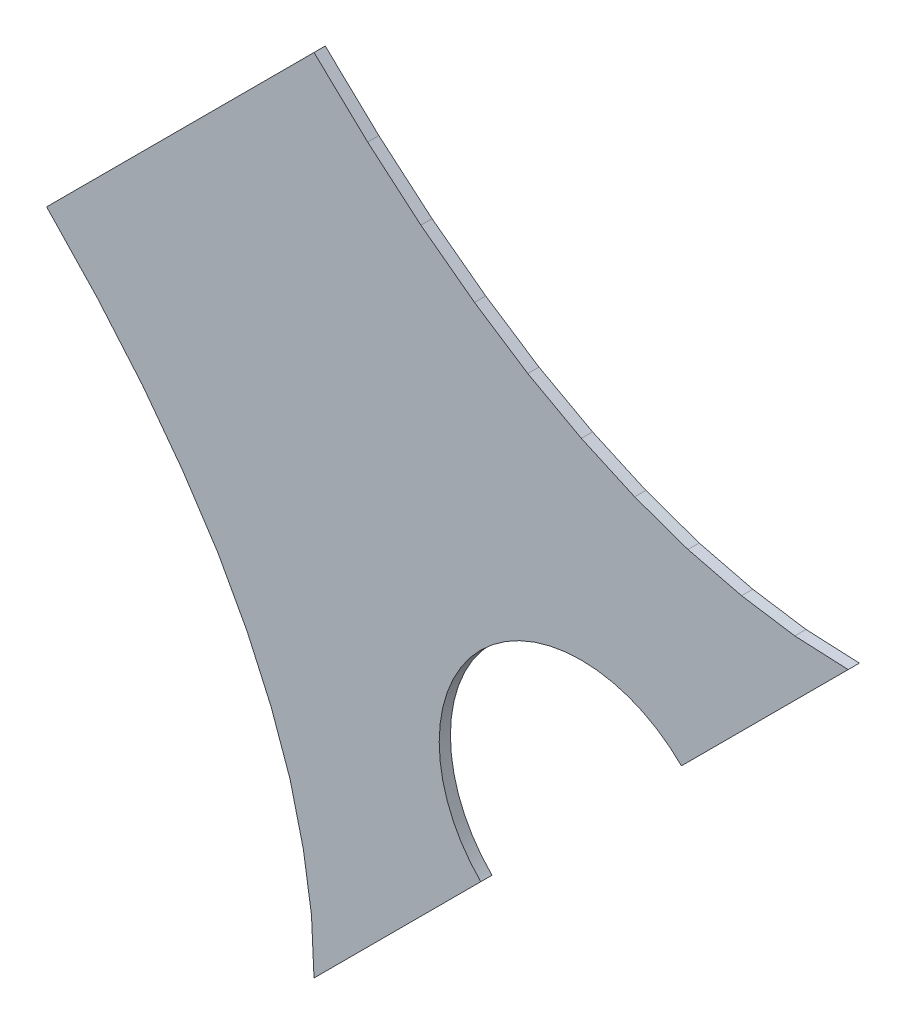
ISO-10303-21;
HEADER;
FILE_DESCRIPTION(('STEP AP214'),'2;1');
FILE_NAME('part.step','',(''),(''),'','','');
FILE_SCHEMA(('AUTOMOTIVE_DESIGN { 1 0 10303 214 1 1 1 1 }'));
ENDSEC;
DATA;
#1=APPLICATION_CONTEXT('core data for automotive mechanical design processes');
#2=APPLICATION_PROTOCOL_DEFINITION('international standard','automotive_design',2000,#1);
#3=PRODUCT_CONTEXT('',#1,'mechanical');
#4=PRODUCT('Part','Part','',(#3));
#5=PRODUCT_RELATED_PRODUCT_CATEGORY('part','',(#4));
#6=PRODUCT_DEFINITION_FORMATION('','',#4);
#7=PRODUCT_DEFINITION_CONTEXT('part definition',#1,'design');
#8=PRODUCT_DEFINITION('design','',#6,#7);
#9=PRODUCT_DEFINITION_SHAPE('','',#8);
#10=(LENGTH_UNIT() NAMED_UNIT(*) SI_UNIT(.MILLI.,.METRE.));
#11=(NAMED_UNIT(*) PLANE_ANGLE_UNIT() SI_UNIT($,.RADIAN.));
#12=(NAMED_UNIT(*) SI_UNIT($,.STERADIAN.) SOLID_ANGLE_UNIT());
#13=UNCERTAINTY_MEASURE_WITH_UNIT(LENGTH_MEASURE(1.E-05),#10,'distance_accuracy_value','');
#14=(GEOMETRIC_REPRESENTATION_CONTEXT(3) GLOBAL_UNCERTAINTY_ASSIGNED_CONTEXT((#13)) GLOBAL_UNIT_ASSIGNED_CONTEXT((#10,
#11,#12)) REPRESENTATION_CONTEXT('',''));
#15=CARTESIAN_POINT('',(0.,0.,0.));
#16=DIRECTION('',(0.,0.,1.));
#17=DIRECTION('',(1.,0.,0.));
#18=AXIS2_PLACEMENT_3D('',#15,#16,#17);
#19=CARTESIAN_POINT('',(35.0530014038086,57.6549987792969,0.));
#20=DIRECTION('',(0.707106781186548,-0.707106781186548,0.));
#21=DIRECTION('',(-0.707106781186548,-0.707106781186548,0.));
#22=AXIS2_PLACEMENT_3D('',#19,#20,#21);
#23=PLANE('',#22);
#24=DIRECTION('',(-0.707106781186548,-0.707106781186548,0.));
#25=VECTOR('',#24,1.);
#26=CARTESIAN_POINT('',(35.0530014038086,57.6549987792969,0.03556));
#27=LINE('',#26,#25);
#28=CARTESIAN_POINT('',(35.0530014038086,57.6549987792969,0.03556));
#29=VERTEX_POINT('',#28);
#30=CARTESIAN_POINT('',(34.2050018310547,56.806999206543,0.03556));
#31=VERTEX_POINT('',#30);
#32=EDGE_CURVE('E11',#29,#31,#27,.T.);
#33=ORIENTED_EDGE('',*,*,#32,.F.);
#34=DIRECTION('',(0.,0.,1.));
#35=VECTOR('',#34,1.);
#36=CARTESIAN_POINT('',(35.0530014038086,57.6549987792969,0.));
#37=LINE('',#36,#35);
#38=CARTESIAN_POINT('',(35.0530014038086,57.6549987792969,0.));
#39=VERTEX_POINT('',#38);
#40=EDGE_CURVE('E24',#39,#29,#37,.T.);
#41=ORIENTED_EDGE('',*,*,#40,.F.);
#42=DIRECTION('',(-0.707106781186548,-0.707106781186548,0.));
#43=VECTOR('',#42,1.);
#44=CARTESIAN_POINT('',(35.0530014038086,57.6549987792969,0.));
#45=LINE('',#44,#43);
#46=CARTESIAN_POINT('',(34.2050018310547,56.806999206543,0.));
#47=VERTEX_POINT('',#46);
#48=EDGE_CURVE('E367',#39,#47,#45,.T.);
#49=ORIENTED_EDGE('',*,*,#48,.T.);
#50=DIRECTION('',(0.,0.,1.));
#51=VECTOR('',#50,1.);
#52=CARTESIAN_POINT('',(34.2050018310547,56.806999206543,0.));
#53=LINE('',#52,#51);
#54=EDGE_CURVE('E37',#47,#31,#53,.T.);
#55=ORIENTED_EDGE('',*,*,#54,.T.);
#56=EDGE_LOOP('',(#33,#41,#49,#55));
#57=FACE_BOUND('',#56,.T.);
#58=ADVANCED_FACE('F17',(#57),#23,.F.);
#59=CARTESIAN_POINT('',(35.2229995727539,57.4939994812012,0.));
#60=DIRECTION('',(-0.687628497961124,-0.726062703071662,0.));
#61=DIRECTION('',(-0.726062703071662,0.687628497961124,0.));
#62=AXIS2_PLACEMENT_3D('',#59,#60,#61);
#63=PLANE('',#62);
#64=DIRECTION('',(-0.726062703071662,0.687628497961124,0.));
#65=VECTOR('',#64,1.);
#66=CARTESIAN_POINT('',(35.2229995727539,57.4939994812012,0.03556));
#67=LINE('',#66,#65);
#68=CARTESIAN_POINT('',(35.2229995727539,57.4939994812012,0.03556));
#69=VERTEX_POINT('',#68);
#70=EDGE_CURVE('E363',#69,#29,#67,.T.);
#71=ORIENTED_EDGE('',*,*,#70,.F.);
#72=DIRECTION('',(0.,0.,1.));
#73=VECTOR('',#72,1.);
#74=CARTESIAN_POINT('',(35.2229995727539,57.4939994812012,0.));
#75=LINE('',#74,#73);
#76=CARTESIAN_POINT('',(35.2229995727539,57.4939994812012,0.));
#77=VERTEX_POINT('',#76);
#78=EDGE_CURVE('E361',#77,#69,#75,.T.);
#79=ORIENTED_EDGE('',*,*,#78,.F.);
#80=DIRECTION('',(-0.726062703071662,0.687628497961124,0.));
#81=VECTOR('',#80,1.);
#82=CARTESIAN_POINT('',(35.2229995727539,57.4939994812012,0.));
#83=LINE('',#82,#81);
#84=EDGE_CURVE('E359',#77,#39,#83,.T.);
#85=ORIENTED_EDGE('',*,*,#84,.T.);
#86=ORIENTED_EDGE('',*,*,#40,.T.);
#87=EDGE_LOOP('',(#71,#79,#85,#86));
#88=FACE_BOUND('',#87,.T.);
#89=ADVANCED_FACE('F370',(#88),#63,.F.);
#90=CARTESIAN_POINT('',(35.3919982910156,57.3499984741211,0.));
#91=DIRECTION('',(-0.648568593878448,-0.761156211979205,0.));
#92=DIRECTION('',(-0.761156211979205,0.648568593878448,0.));
#93=AXIS2_PLACEMENT_3D('',#90,#91,#92);
#94=PLANE('',#93);
#95=DIRECTION('',(-0.761156211979205,0.648568593878448,0.));
#96=VECTOR('',#95,1.);
#97=CARTESIAN_POINT('',(35.3919982910156,57.3499984741211,0.03556));
#98=LINE('',#97,#96);
#99=CARTESIAN_POINT('',(35.3919982910156,57.3499984741211,0.03556));
#100=VERTEX_POINT('',#99);
#101=EDGE_CURVE('E356',#100,#69,#98,.T.);
#102=ORIENTED_EDGE('',*,*,#101,.F.);
#103=DIRECTION('',(0.,0.,1.));
#104=VECTOR('',#103,1.);
#105=CARTESIAN_POINT('',(35.3919982910156,57.3499984741211,0.));
#106=LINE('',#105,#104);
#107=CARTESIAN_POINT('',(35.3919982910156,57.3499984741211,0.));
#108=VERTEX_POINT('',#107);
#109=EDGE_CURVE('E354',#108,#100,#106,.T.);
#110=ORIENTED_EDGE('',*,*,#109,.F.);
#111=DIRECTION('',(-0.761156211979205,0.648568593878448,0.));
#112=VECTOR('',#111,1.);
#113=CARTESIAN_POINT('',(35.3919982910156,57.3499984741211,0.));
#114=LINE('',#113,#112);
#115=EDGE_CURVE('E351',#108,#77,#114,.T.);
#116=ORIENTED_EDGE('',*,*,#115,.T.);
#117=ORIENTED_EDGE('',*,*,#78,.T.);
#118=EDGE_LOOP('',(#102,#110,#116,#117));
#119=FACE_BOUND('',#118,.T.);
#120=ADVANCED_FACE('F373',(#119),#94,.F.);
#121=CARTESIAN_POINT('',(35.5620002746582,57.2229995727539,0.));
#122=DIRECTION('',(-0.598483120475566,-0.801135415835444,0.));
#123=DIRECTION('',(-0.801135415835444,0.598483120475566,0.));
#124=AXIS2_PLACEMENT_3D('',#121,#122,#123);
#125=PLANE('',#124);
#126=DIRECTION('',(-0.801135415835444,0.598483120475566,0.));
#127=VECTOR('',#126,1.);
#128=CARTESIAN_POINT('',(35.5620002746582,57.2229995727539,0.03556));
#129=LINE('',#128,#127);
#130=CARTESIAN_POINT('',(35.5620002746582,57.2229995727539,0.03556));
#131=VERTEX_POINT('',#130);
#132=EDGE_CURVE('E348',#131,#100,#129,.T.);
#133=ORIENTED_EDGE('',*,*,#132,.F.);
#134=DIRECTION('',(0.,0.,1.));
#135=VECTOR('',#134,1.);
#136=CARTESIAN_POINT('',(35.5620002746582,57.2229995727539,0.));
#137=LINE('',#136,#135);
#138=CARTESIAN_POINT('',(35.5620002746582,57.2229995727539,0.));
#139=VERTEX_POINT('',#138);
#140=EDGE_CURVE('E346',#139,#131,#137,.T.);
#141=ORIENTED_EDGE('',*,*,#140,.F.);
#142=DIRECTION('',(-0.801135415835444,0.598483120475566,0.));
#143=VECTOR('',#142,1.);
#144=CARTESIAN_POINT('',(35.5620002746582,57.2229995727539,0.));
#145=LINE('',#144,#143);
#146=EDGE_CURVE('E343',#139,#108,#145,.T.);
#147=ORIENTED_EDGE('',*,*,#146,.T.);
#148=ORIENTED_EDGE('',*,*,#109,.T.);
#149=EDGE_LOOP('',(#133,#141,#147,#148));
#150=FACE_BOUND('',#149,.T.);
#151=ADVANCED_FACE('F378',(#150),#125,.F.);
#152=CARTESIAN_POINT('',(35.7309989929199,57.1119995117188,0.));
#153=DIRECTION('',(-0.548983611370838,-0.8358331139924,0.));
#154=DIRECTION('',(-0.8358331139924,0.548983611370838,0.));
#155=AXIS2_PLACEMENT_3D('',#152,#153,#154);
#156=PLANE('',#155);
#157=DIRECTION('',(-0.8358331139924,0.548983611370838,0.));
#158=VECTOR('',#157,1.);
#159=CARTESIAN_POINT('',(35.7309989929199,57.1119995117188,0.03556));
#160=LINE('',#159,#158);
#161=CARTESIAN_POINT('',(35.7309989929199,57.1119995117188,0.03556));
#162=VERTEX_POINT('',#161);
#163=EDGE_CURVE('E340',#162,#131,#160,.T.);
#164=ORIENTED_EDGE('',*,*,#163,.F.);
#165=DIRECTION('',(0.,0.,1.));
#166=VECTOR('',#165,1.);
#167=CARTESIAN_POINT('',(35.7309989929199,57.1119995117188,0.));
#168=LINE('',#167,#166);
#169=CARTESIAN_POINT('',(35.7309989929199,57.1119995117188,0.));
#170=VERTEX_POINT('',#169);
#171=EDGE_CURVE('E338',#170,#162,#168,.T.);
#172=ORIENTED_EDGE('',*,*,#171,.F.);
#173=DIRECTION('',(-0.8358331139924,0.548983611370838,0.));
#174=VECTOR('',#173,1.);
#175=CARTESIAN_POINT('',(35.7309989929199,57.1119995117188,0.));
#176=LINE('',#175,#174);
#177=EDGE_CURVE('E335',#170,#139,#176,.T.);
#178=ORIENTED_EDGE('',*,*,#177,.T.);
#179=ORIENTED_EDGE('',*,*,#140,.T.);
#180=EDGE_LOOP('',(#164,#172,#178,#179));
#181=FACE_BOUND('',#180,.T.);
#182=ADVANCED_FACE('F381',(#181),#156,.F.);
#183=CARTESIAN_POINT('',(35.9010009765625,57.0190010070801,0.));
#184=DIRECTION('',(-0.479926229158131,-0.877308847878589,0.));
#185=DIRECTION('',(-0.877308847878589,0.479926229158131,0.));
#186=AXIS2_PLACEMENT_3D('',#183,#184,#185);
#187=PLANE('',#186);
#188=DIRECTION('',(-0.877308847878589,0.479926229158131,0.));
#189=VECTOR('',#188,1.);
#190=CARTESIAN_POINT('',(35.9010009765625,57.0190010070801,0.03556));
#191=LINE('',#190,#189);
#192=CARTESIAN_POINT('',(35.9010009765625,57.0190010070801,0.03556));
#193=VERTEX_POINT('',#192);
#194=EDGE_CURVE('E332',#193,#162,#191,.T.);
#195=ORIENTED_EDGE('',*,*,#194,.F.);
#196=DIRECTION('',(0.,0.,1.));
#197=VECTOR('',#196,1.);
#198=CARTESIAN_POINT('',(35.9010009765625,57.0190010070801,0.));
#199=LINE('',#198,#197);
#200=CARTESIAN_POINT('',(35.9010009765625,57.0190010070801,0.));
#201=VERTEX_POINT('',#200);
#202=EDGE_CURVE('E330',#201,#193,#199,.T.);
#203=ORIENTED_EDGE('',*,*,#202,.F.);
#204=DIRECTION('',(-0.877308847878589,0.479926229158131,0.));
#205=VECTOR('',#204,1.);
#206=CARTESIAN_POINT('',(35.9010009765625,57.0190010070801,0.));
#207=LINE('',#206,#205);
#208=EDGE_CURVE('E327',#201,#170,#207,.T.);
#209=ORIENTED_EDGE('',*,*,#208,.T.);
#210=ORIENTED_EDGE('',*,*,#171,.T.);
#211=EDGE_LOOP('',(#195,#203,#209,#210));
#212=FACE_BOUND('',#211,.T.);
#213=ADVANCED_FACE('F386',(#212),#187,.F.);
#214=CARTESIAN_POINT('',(36.0699996948242,56.943000793457,0.));
#215=DIRECTION('',(-0.410143821061832,-0.912020858338668,0.));
#216=DIRECTION('',(-0.912020858338668,0.410143821061832,0.));
#217=AXIS2_PLACEMENT_3D('',#214,#215,#216);
#218=PLANE('',#217);
#219=DIRECTION('',(-0.912020858338668,0.410143821061832,0.));
#220=VECTOR('',#219,1.);
#221=CARTESIAN_POINT('',(36.0699996948242,56.943000793457,0.03556));
#222=LINE('',#221,#220);
#223=CARTESIAN_POINT('',(36.0699996948242,56.943000793457,0.03556));
#224=VERTEX_POINT('',#223);
#225=EDGE_CURVE('E324',#224,#193,#222,.T.);
#226=ORIENTED_EDGE('',*,*,#225,.F.);
#227=DIRECTION('',(0.,0.,1.));
#228=VECTOR('',#227,1.);
#229=CARTESIAN_POINT('',(36.0699996948242,56.943000793457,0.));
#230=LINE('',#229,#228);
#231=CARTESIAN_POINT('',(36.0699996948242,56.943000793457,0.));
#232=VERTEX_POINT('',#231);
#233=EDGE_CURVE('E322',#232,#224,#230,.T.);
#234=ORIENTED_EDGE('',*,*,#233,.F.);
#235=DIRECTION('',(-0.912020858338668,0.410143821061832,0.));
#236=VECTOR('',#235,1.);
#237=CARTESIAN_POINT('',(36.0699996948242,56.943000793457,0.));
#238=LINE('',#237,#236);
#239=EDGE_CURVE('E319',#232,#201,#238,.T.);
#240=ORIENTED_EDGE('',*,*,#239,.T.);
#241=ORIENTED_EDGE('',*,*,#202,.T.);
#242=EDGE_LOOP('',(#226,#234,#240,#241));
#243=FACE_BOUND('',#242,.T.);
#244=ADVANCED_FACE('F389',(#243),#218,.F.);
#245=CARTESIAN_POINT('',(36.2389984130859,56.882999420166,0.));
#246=DIRECTION('',(-0.334578654917434,-0.942367828225073,0.));
#247=DIRECTION('',(-0.942367828225073,0.334578654917434,0.));
#248=AXIS2_PLACEMENT_3D('',#245,#246,#247);
#249=PLANE('',#248);
#250=DIRECTION('',(-0.942367828225073,0.334578654917434,0.));
#251=VECTOR('',#250,1.);
#252=CARTESIAN_POINT('',(36.2389984130859,56.882999420166,0.03556));
#253=LINE('',#252,#251);
#254=CARTESIAN_POINT('',(36.2389984130859,56.882999420166,0.03556));
#255=VERTEX_POINT('',#254);
#256=EDGE_CURVE('E316',#255,#224,#253,.T.);
#257=ORIENTED_EDGE('',*,*,#256,.F.);
#258=DIRECTION('',(0.,0.,1.));
#259=VECTOR('',#258,1.);
#260=CARTESIAN_POINT('',(36.2389984130859,56.882999420166,0.));
#261=LINE('',#260,#259);
#262=CARTESIAN_POINT('',(36.2389984130859,56.882999420166,0.));
#263=VERTEX_POINT('',#262);
#264=EDGE_CURVE('E314',#263,#255,#261,.T.);
#265=ORIENTED_EDGE('',*,*,#264,.F.);
#266=DIRECTION('',(-0.942367828225073,0.334578654917434,0.));
#267=VECTOR('',#266,1.);
#268=CARTESIAN_POINT('',(36.2389984130859,56.882999420166,0.));
#269=LINE('',#268,#267);
#270=EDGE_CURVE('E311',#263,#232,#269,.T.);
#271=ORIENTED_EDGE('',*,*,#270,.T.);
#272=ORIENTED_EDGE('',*,*,#233,.T.);
#273=EDGE_LOOP('',(#257,#265,#271,#272));
#274=FACE_BOUND('',#273,.T.);
#275=ADVANCED_FACE('F394',(#274),#249,.F.);
#276=CARTESIAN_POINT('',(36.4090003967285,56.8409996032715,0.));
#277=DIRECTION('',(-0.239843706355108,-0.970811514415566,0.));
#278=DIRECTION('',(-0.970811514415566,0.239843706355108,0.));
#279=AXIS2_PLACEMENT_3D('',#276,#277,#278);
#280=PLANE('',#279);
#281=DIRECTION('',(-0.970811514415566,0.239843706355108,0.));
#282=VECTOR('',#281,1.);
#283=CARTESIAN_POINT('',(36.4090003967285,56.8409996032715,0.03556));
#284=LINE('',#283,#282);
#285=CARTESIAN_POINT('',(36.4090003967285,56.8409996032715,0.03556));
#286=VERTEX_POINT('',#285);
#287=EDGE_CURVE('E308',#286,#255,#284,.T.);
#288=ORIENTED_EDGE('',*,*,#287,.F.);
#289=DIRECTION('',(0.,0.,1.));
#290=VECTOR('',#289,1.);
#291=CARTESIAN_POINT('',(36.4090003967285,56.8409996032715,0.));
#292=LINE('',#291,#290);
#293=CARTESIAN_POINT('',(36.4090003967285,56.8409996032715,0.));
#294=VERTEX_POINT('',#293);
#295=EDGE_CURVE('E306',#294,#286,#292,.T.);
#296=ORIENTED_EDGE('',*,*,#295,.F.);
#297=DIRECTION('',(-0.970811514415566,0.239843706355108,0.));
#298=VECTOR('',#297,1.);
#299=CARTESIAN_POINT('',(36.4090003967285,56.8409996032715,0.));
#300=LINE('',#299,#298);
#301=EDGE_CURVE('E303',#294,#263,#300,.T.);
#302=ORIENTED_EDGE('',*,*,#301,.T.);
#303=ORIENTED_EDGE('',*,*,#264,.T.);
#304=EDGE_LOOP('',(#288,#296,#302,#303));
#305=FACE_BOUND('',#304,.T.);
#306=ADVANCED_FACE('F397',(#305),#280,.F.);
#307=CARTESIAN_POINT('',(36.5779991149902,56.814998626709,0.));
#308=DIRECTION('',(-0.152063890099214,-0.988370665958827,0.));
#309=DIRECTION('',(-0.988370665958827,0.152063890099214,0.));
#310=AXIS2_PLACEMENT_3D('',#307,#308,#309);
#311=PLANE('',#310);
#312=DIRECTION('',(-0.988370665958827,0.152063890099214,0.));
#313=VECTOR('',#312,1.);
#314=CARTESIAN_POINT('',(36.5779991149902,56.814998626709,0.03556));
#315=LINE('',#314,#313);
#316=CARTESIAN_POINT('',(36.5779991149902,56.814998626709,0.03556));
#317=VERTEX_POINT('',#316);
#318=EDGE_CURVE('E300',#317,#286,#315,.T.);
#319=ORIENTED_EDGE('',*,*,#318,.F.);
#320=DIRECTION('',(0.,0.,1.));
#321=VECTOR('',#320,1.);
#322=CARTESIAN_POINT('',(36.5779991149902,56.814998626709,0.));
#323=LINE('',#322,#321);
#324=CARTESIAN_POINT('',(36.5779991149902,56.814998626709,0.));
#325=VERTEX_POINT('',#324);
#326=EDGE_CURVE('E298',#325,#317,#323,.T.);
#327=ORIENTED_EDGE('',*,*,#326,.F.);
#328=DIRECTION('',(-0.988370665958827,0.152063890099214,0.));
#329=VECTOR('',#328,1.);
#330=CARTESIAN_POINT('',(36.5779991149902,56.814998626709,0.));
#331=LINE('',#330,#329);
#332=EDGE_CURVE('E295',#325,#294,#331,.T.);
#333=ORIENTED_EDGE('',*,*,#332,.T.);
#334=ORIENTED_EDGE('',*,*,#295,.T.);
#335=EDGE_LOOP('',(#319,#327,#333,#334));
#336=FACE_BOUND('',#335,.T.);
#337=ADVANCED_FACE('F402',(#336),#311,.F.);
#338=CARTESIAN_POINT('',(36.7470016479492,56.806999206543,0.));
#339=DIRECTION('',(-0.0472802034462182,-0.998881665845402,0.));
#340=DIRECTION('',(-0.998881665845402,0.0472802034462182,0.));
#341=AXIS2_PLACEMENT_3D('',#338,#339,#340);
#342=PLANE('',#341);
#343=DIRECTION('',(-0.998881665845401,0.0472802034462182,0.));
#344=VECTOR('',#343,1.);
#345=CARTESIAN_POINT('',(36.7470016479492,56.806999206543,0.03556));
#346=LINE('',#345,#344);
#347=CARTESIAN_POINT('',(36.7470016479492,56.806999206543,0.03556));
#348=VERTEX_POINT('',#347);
#349=EDGE_CURVE('E292',#348,#317,#346,.T.);
#350=ORIENTED_EDGE('',*,*,#349,.F.);
#351=DIRECTION('',(0.,0.,1.));
#352=VECTOR('',#351,1.);
#353=CARTESIAN_POINT('',(36.7470016479492,56.806999206543,0.));
#354=LINE('',#353,#352);
#355=CARTESIAN_POINT('',(36.7470016479492,56.806999206543,0.));
#356=VERTEX_POINT('',#355);
#357=EDGE_CURVE('E290',#356,#348,#354,.T.);
#358=ORIENTED_EDGE('',*,*,#357,.F.);
#359=DIRECTION('',(-0.998881665845401,0.0472802034462182,0.));
#360=VECTOR('',#359,1.);
#361=CARTESIAN_POINT('',(36.7470016479492,56.806999206543,0.));
#362=LINE('',#361,#360);
#363=EDGE_CURVE('E287',#356,#325,#362,.T.);
#364=ORIENTED_EDGE('',*,*,#363,.T.);
#365=ORIENTED_EDGE('',*,*,#326,.T.);
#366=EDGE_LOOP('',(#350,#358,#364,#365));
#367=FACE_BOUND('',#366,.T.);
#368=ADVANCED_FACE('F405',(#367),#342,.F.);
#369=CARTESIAN_POINT('',(36.2182058358156,56.2782033944093,0.));
#370=DIRECTION('',(-0.707106781186548,0.707106781186548,0.));
#371=DIRECTION('',(0.707106781186548,0.707106781186548,0.));
#372=AXIS2_PLACEMENT_3D('',#369,#370,#371);
#373=PLANE('',#372);
#374=DIRECTION('',(0.707106781186548,0.707106781186548,0.));
#375=VECTOR('',#374,1.);
#376=CARTESIAN_POINT('',(35.0530014038086,55.1129989624023,0.03556));
#377=LINE('',#376,#375);
#378=CARTESIAN_POINT('',(36.2182058358156,56.2782033944093,0.03556));
#379=VERTEX_POINT('',#378);
#380=EDGE_CURVE('E284',#379,#348,#377,.T.);
#381=ORIENTED_EDGE('',*,*,#380,.F.);
#382=DIRECTION('',(0.,0.,1.));
#383=VECTOR('',#382,1.);
#384=CARTESIAN_POINT('',(36.2182058358156,56.2782033944093,0.));
#385=LINE('',#384,#383);
#386=CARTESIAN_POINT('',(36.2182058358156,56.2782033944093,0.));
#387=VERTEX_POINT('',#386);
#388=EDGE_CURVE('E282',#387,#379,#385,.T.);
#389=ORIENTED_EDGE('',*,*,#388,.F.);
#390=DIRECTION('',(0.707106781186548,0.707106781186548,0.));
#391=VECTOR('',#390,1.);
#392=CARTESIAN_POINT('',(35.0530014038086,55.1129989624023,0.));
#393=LINE('',#392,#391);
#394=EDGE_CURVE('E279',#387,#356,#393,.T.);
#395=ORIENTED_EDGE('',*,*,#394,.T.);
#396=ORIENTED_EDGE('',*,*,#357,.T.);
#397=EDGE_LOOP('',(#381,#389,#395,#396));
#398=FACE_BOUND('',#397,.T.);
#399=ADVANCED_FACE('F410',(#398),#373,.F.);
#400=CARTESIAN_POINT('',(35.9000044,55.96001,0.));
#401=DIRECTION('',(0.,0.,-1.));
#402=DIRECTION('',(1.,0.,0.));
#403=AXIS2_PLACEMENT_3D('',#400,#401,#402);
#404=CYLINDRICAL_SURFACE('',#403,0.4499991);
#405=ORIENTED_EDGE('',*,*,#388,.T.);
#406=CARTESIAN_POINT('',(35.9000044,55.96001,0.03556));
#407=DIRECTION('',(0.,0.,1.));
#408=DIRECTION('',(1.,0.,0.));
#409=AXIS2_PLACEMENT_3D('',#406,#407,#408);
#410=CIRCLE('',#409,0.4499991);
#411=CARTESIAN_POINT('',(35.5818110055907,55.6418085641844,0.03556));
#412=VERTEX_POINT('',#411);
#413=EDGE_CURVE('E276',#379,#412,#410,.T.);
#414=ORIENTED_EDGE('',*,*,#413,.T.);
#415=DIRECTION('',(0.,0.,1.));
#416=VECTOR('',#415,1.);
#417=CARTESIAN_POINT('',(35.5818110055907,55.6418085641844,0.));
#418=LINE('',#417,#416);
#419=CARTESIAN_POINT('',(35.5818110055907,55.6418085641844,0.));
#420=VERTEX_POINT('',#419);
#421=EDGE_CURVE('E274',#420,#412,#418,.T.);
#422=ORIENTED_EDGE('',*,*,#421,.F.);
#423=CARTESIAN_POINT('',(35.9000044,55.96001,0.));
#424=DIRECTION('',(0.,0.,1.));
#425=DIRECTION('',(1.,0.,0.));
#426=AXIS2_PLACEMENT_3D('',#423,#424,#425);
#427=CIRCLE('',#426,0.4499991);
#428=EDGE_CURVE('E271',#387,#420,#427,.T.);
#429=ORIENTED_EDGE('',*,*,#428,.F.);
#430=EDGE_LOOP('',(#405,#414,#422,#429));
#431=FACE_BOUND('',#430,.T.);
#432=ADVANCED_FACE('F413',(#431),#404,.F.);
#433=CARTESIAN_POINT('',(35.0530014038086,55.1129989624023,0.));
#434=DIRECTION('',(-0.707106781186548,0.707106781186548,0.));
#435=DIRECTION('',(0.707106781186548,0.707106781186548,0.));
#436=AXIS2_PLACEMENT_3D('',#433,#434,#435);
#437=PLANE('',#436);
#438=DIRECTION('',(0.707106781186548,0.707106781186548,0.));
#439=VECTOR('',#438,1.);
#440=CARTESIAN_POINT('',(35.0530014038086,55.1129989624023,0.03556));
#441=LINE('',#440,#439);
#442=CARTESIAN_POINT('',(35.0530014038086,55.1129989624023,0.03556));
#443=VERTEX_POINT('',#442);
#444=EDGE_CURVE('E268',#443,#412,#441,.T.);
#445=ORIENTED_EDGE('',*,*,#444,.F.);
#446=DIRECTION('',(0.,0.,1.));
#447=VECTOR('',#446,1.);
#448=CARTESIAN_POINT('',(35.0530014038086,55.1129989624023,0.));
#449=LINE('',#448,#447);
#450=CARTESIAN_POINT('',(35.0530014038086,55.1129989624023,0.));
#451=VERTEX_POINT('',#450);
#452=EDGE_CURVE('E266',#451,#443,#449,.T.);
#453=ORIENTED_EDGE('',*,*,#452,.F.);
#454=EDGE_CURVE('E265',#451,#420,#393,.T.);
#455=ORIENTED_EDGE('',*,*,#454,.T.);
#456=ORIENTED_EDGE('',*,*,#421,.T.);
#457=EDGE_LOOP('',(#445,#453,#455,#456));
#458=FACE_BOUND('',#457,.T.);
#459=ADVANCED_FACE('F419',(#458),#437,.F.);
#460=CARTESIAN_POINT('',(35.0449981689453,55.2820014953613,0.));
#461=DIRECTION('',(0.99888060077791,0.0473026996012021,0.));
#462=DIRECTION('',(0.0473026996012021,-0.99888060077791,0.));
#463=AXIS2_PLACEMENT_3D('',#460,#461,#462);
#464=PLANE('',#463);
#465=DIRECTION('',(0.0473026996012021,-0.99888060077791,0.));
#466=VECTOR('',#465,1.);
#467=CARTESIAN_POINT('',(35.0449981689453,55.2820014953613,0.03556));
#468=LINE('',#467,#466);
#469=CARTESIAN_POINT('',(35.0449981689453,55.2820014953613,0.03556));
#470=VERTEX_POINT('',#469);
#471=EDGE_CURVE('E262',#470,#443,#468,.T.);
#472=ORIENTED_EDGE('',*,*,#471,.F.);
#473=DIRECTION('',(0.,0.,1.));
#474=VECTOR('',#473,1.);
#475=CARTESIAN_POINT('',(35.0449981689453,55.2820014953613,0.));
#476=LINE('',#475,#474);
#477=CARTESIAN_POINT('',(35.0449981689453,55.2820014953613,0.));
#478=VERTEX_POINT('',#477);
#479=EDGE_CURVE('E260',#478,#470,#476,.T.);
#480=ORIENTED_EDGE('',*,*,#479,.F.);
#481=DIRECTION('',(0.0473026996012021,-0.99888060077791,0.));
#482=VECTOR('',#481,1.);
#483=CARTESIAN_POINT('',(35.0449981689453,55.2820014953613,0.));
#484=LINE('',#483,#482);
#485=EDGE_CURVE('E257',#478,#451,#484,.T.);
#486=ORIENTED_EDGE('',*,*,#485,.T.);
#487=ORIENTED_EDGE('',*,*,#452,.T.);
#488=EDGE_LOOP('',(#472,#480,#486,#487));
#489=FACE_BOUND('',#488,.T.);
#490=ADVANCED_FACE('F422',(#489),#464,.F.);
#491=CARTESIAN_POINT('',(35.0190010070801,55.451000213623,0.));
#492=DIRECTION('',(0.98837401879867,0.152042096025302,0.));
#493=DIRECTION('',(0.152042096025302,-0.98837401879867,0.));
#494=AXIS2_PLACEMENT_3D('',#491,#492,#493);
#495=PLANE('',#494);
#496=DIRECTION('',(0.152042096025302,-0.98837401879867,0.));
#497=VECTOR('',#496,1.);
#498=CARTESIAN_POINT('',(35.0190010070801,55.451000213623,0.03556));
#499=LINE('',#498,#497);
#500=CARTESIAN_POINT('',(35.0190010070801,55.451000213623,0.03556));
#501=VERTEX_POINT('',#500);
#502=EDGE_CURVE('E254',#501,#470,#499,.T.);
#503=ORIENTED_EDGE('',*,*,#502,.F.);
#504=DIRECTION('',(0.,0.,1.));
#505=VECTOR('',#504,1.);
#506=CARTESIAN_POINT('',(35.0190010070801,55.451000213623,0.));
#507=LINE('',#506,#505);
#508=CARTESIAN_POINT('',(35.0190010070801,55.451000213623,0.));
#509=VERTEX_POINT('',#508);
#510=EDGE_CURVE('E252',#509,#501,#507,.T.);
#511=ORIENTED_EDGE('',*,*,#510,.F.);
#512=DIRECTION('',(0.152042096025302,-0.98837401879867,0.));
#513=VECTOR('',#512,1.);
#514=CARTESIAN_POINT('',(35.0190010070801,55.451000213623,0.));
#515=LINE('',#514,#513);
#516=EDGE_CURVE('E249',#509,#478,#515,.T.);
#517=ORIENTED_EDGE('',*,*,#516,.T.);
#518=ORIENTED_EDGE('',*,*,#479,.T.);
#519=EDGE_LOOP('',(#503,#511,#517,#518));
#520=FACE_BOUND('',#519,.T.);
#521=ADVANCED_FACE('F427',(#520),#495,.F.);
#522=CARTESIAN_POINT('',(34.9770011901855,55.6209983825684,0.));
#523=DIRECTION('',(0.970810261241385,0.239848778751182,0.));
#524=DIRECTION('',(0.239848778751182,-0.970810261241385,0.));
#525=AXIS2_PLACEMENT_3D('',#522,#523,#524);
#526=PLANE('',#525);
#527=DIRECTION('',(0.239848778751182,-0.970810261241385,0.));
#528=VECTOR('',#527,1.);
#529=CARTESIAN_POINT('',(34.9770011901855,55.6209983825684,0.03556));
#530=LINE('',#529,#528);
#531=CARTESIAN_POINT('',(34.9770011901855,55.6209983825684,0.03556));
#532=VERTEX_POINT('',#531);
#533=EDGE_CURVE('E246',#532,#501,#530,.T.);
#534=ORIENTED_EDGE('',*,*,#533,.F.);
#535=DIRECTION('',(0.,0.,1.));
#536=VECTOR('',#535,1.);
#537=CARTESIAN_POINT('',(34.9770011901855,55.6209983825684,0.));
#538=LINE('',#537,#536);
#539=CARTESIAN_POINT('',(34.9770011901855,55.6209983825684,0.));
#540=VERTEX_POINT('',#539);
#541=EDGE_CURVE('E244',#540,#532,#538,.T.);
#542=ORIENTED_EDGE('',*,*,#541,.F.);
#543=DIRECTION('',(0.239848778751182,-0.970810261241385,0.));
#544=VECTOR('',#543,1.);
#545=CARTESIAN_POINT('',(34.9770011901855,55.6209983825684,0.));
#546=LINE('',#545,#544);
#547=EDGE_CURVE('E241',#540,#509,#546,.T.);
#548=ORIENTED_EDGE('',*,*,#547,.T.);
#549=ORIENTED_EDGE('',*,*,#510,.T.);
#550=EDGE_LOOP('',(#534,#542,#548,#549));
#551=FACE_BOUND('',#550,.T.);
#552=ADVANCED_FACE('F430',(#551),#526,.F.);
#553=CARTESIAN_POINT('',(34.9169998168945,55.7900009155274,0.));
#554=DIRECTION('',(0.9423702093409,0.334571948236531,0.));
#555=DIRECTION('',(0.334571948236531,-0.9423702093409,0.));
#556=AXIS2_PLACEMENT_3D('',#553,#554,#555);
#557=PLANE('',#556);
#558=DIRECTION('',(0.334571948236531,-0.9423702093409,0.));
#559=VECTOR('',#558,1.);
#560=CARTESIAN_POINT('',(34.9169998168945,55.7900009155273,0.03556));
#561=LINE('',#560,#559);
#562=CARTESIAN_POINT('',(34.9169998168945,55.7900009155273,0.03556));
#563=VERTEX_POINT('',#562);
#564=EDGE_CURVE('E238',#563,#532,#561,.T.);
#565=ORIENTED_EDGE('',*,*,#564,.F.);
#566=DIRECTION('',(0.,0.,1.));
#567=VECTOR('',#566,1.);
#568=CARTESIAN_POINT('',(34.9169998168945,55.7900009155273,0.));
#569=LINE('',#568,#567);
#570=CARTESIAN_POINT('',(34.9169998168945,55.7900009155273,0.));
#571=VERTEX_POINT('',#570);
#572=EDGE_CURVE('E236',#571,#563,#569,.T.);
#573=ORIENTED_EDGE('',*,*,#572,.F.);
#574=DIRECTION('',(0.334571948236531,-0.9423702093409,0.));
#575=VECTOR('',#574,1.);
#576=CARTESIAN_POINT('',(34.9169998168945,55.7900009155273,0.));
#577=LINE('',#576,#575);
#578=EDGE_CURVE('E233',#571,#540,#577,.T.);
#579=ORIENTED_EDGE('',*,*,#578,.T.);
#580=ORIENTED_EDGE('',*,*,#541,.T.);
#581=EDGE_LOOP('',(#565,#573,#579,#580));
#582=FACE_BOUND('',#581,.T.);
#583=ADVANCED_FACE('F435',(#582),#557,.F.);
#584=CARTESIAN_POINT('',(34.8409996032715,55.9589996337891,0.));
#585=DIRECTION('',(0.912020858338668,0.410143821061832,0.));
#586=DIRECTION('',(0.410143821061832,-0.912020858338668,0.));
#587=AXIS2_PLACEMENT_3D('',#584,#585,#586);
#588=PLANE('',#587);
#589=DIRECTION('',(0.410143821061832,-0.912020858338668,0.));
#590=VECTOR('',#589,1.);
#591=CARTESIAN_POINT('',(34.8409996032715,55.9589996337891,0.03556));
#592=LINE('',#591,#590);
#593=CARTESIAN_POINT('',(34.8409996032715,55.9589996337891,0.03556));
#594=VERTEX_POINT('',#593);
#595=EDGE_CURVE('E230',#594,#563,#592,.T.);
#596=ORIENTED_EDGE('',*,*,#595,.F.);
#597=DIRECTION('',(0.,0.,1.));
#598=VECTOR('',#597,1.);
#599=CARTESIAN_POINT('',(34.8409996032715,55.9589996337891,0.));
#600=LINE('',#599,#598);
#601=CARTESIAN_POINT('',(34.8409996032715,55.9589996337891,0.));
#602=VERTEX_POINT('',#601);
#603=EDGE_CURVE('E228',#602,#594,#600,.T.);
#604=ORIENTED_EDGE('',*,*,#603,.F.);
#605=DIRECTION('',(0.410143821061832,-0.912020858338668,0.));
#606=VECTOR('',#605,1.);
#607=CARTESIAN_POINT('',(34.8409996032715,55.9589996337891,0.));
#608=LINE('',#607,#606);
#609=EDGE_CURVE('E225',#602,#571,#608,.T.);
#610=ORIENTED_EDGE('',*,*,#609,.T.);
#611=ORIENTED_EDGE('',*,*,#572,.T.);
#612=EDGE_LOOP('',(#596,#604,#610,#611));
#613=FACE_BOUND('',#612,.T.);
#614=ADVANCED_FACE('F438',(#613),#588,.F.);
#615=CARTESIAN_POINT('',(34.7480010986328,56.1290016174316,0.));
#616=DIRECTION('',(0.877308847878589,0.479926229158131,0.));
#617=DIRECTION('',(0.479926229158131,-0.877308847878589,0.));
#618=AXIS2_PLACEMENT_3D('',#615,#616,#617);
#619=PLANE('',#618);
#620=DIRECTION('',(0.479926229158131,-0.877308847878589,0.));
#621=VECTOR('',#620,1.);
#622=CARTESIAN_POINT('',(34.7480010986328,56.1290016174316,0.03556));
#623=LINE('',#622,#621);
#624=CARTESIAN_POINT('',(34.7480010986328,56.1290016174316,0.03556));
#625=VERTEX_POINT('',#624);
#626=EDGE_CURVE('E222',#625,#594,#623,.T.);
#627=ORIENTED_EDGE('',*,*,#626,.F.);
#628=DIRECTION('',(0.,0.,1.));
#629=VECTOR('',#628,1.);
#630=CARTESIAN_POINT('',(34.7480010986328,56.1290016174316,0.));
#631=LINE('',#630,#629);
#632=CARTESIAN_POINT('',(34.7480010986328,56.1290016174316,0.));
#633=VERTEX_POINT('',#632);
#634=EDGE_CURVE('E220',#633,#625,#631,.T.);
#635=ORIENTED_EDGE('',*,*,#634,.F.);
#636=DIRECTION('',(0.479926229158131,-0.877308847878589,0.));
#637=VECTOR('',#636,1.);
#638=CARTESIAN_POINT('',(34.7480010986328,56.1290016174316,0.));
#639=LINE('',#638,#637);
#640=EDGE_CURVE('E217',#633,#602,#639,.T.);
#641=ORIENTED_EDGE('',*,*,#640,.T.);
#642=ORIENTED_EDGE('',*,*,#603,.T.);
#643=EDGE_LOOP('',(#627,#635,#641,#642));
#644=FACE_BOUND('',#643,.T.);
#645=ADVANCED_FACE('F442',(#644),#619,.F.);
#646=CARTESIAN_POINT('',(34.6370010375977,56.2980003356934,0.));
#647=DIRECTION('',(0.8358331139924,0.548983611370838,0.));
#648=DIRECTION('',(0.548983611370838,-0.8358331139924,0.));
#649=AXIS2_PLACEMENT_3D('',#646,#647,#648);
#650=PLANE('',#649);
#651=DIRECTION('',(0.548983611370838,-0.8358331139924,0.));
#652=VECTOR('',#651,1.);
#653=CARTESIAN_POINT('',(34.6370010375977,56.2980003356934,0.03556));
#654=LINE('',#653,#652);
#655=CARTESIAN_POINT('',(34.6370010375977,56.2980003356934,0.03556));
#656=VERTEX_POINT('',#655);
#657=EDGE_CURVE('E214',#656,#625,#654,.T.);
#658=ORIENTED_EDGE('',*,*,#657,.F.);
#659=DIRECTION('',(0.,0.,1.));
#660=VECTOR('',#659,1.);
#661=CARTESIAN_POINT('',(34.6370010375977,56.2980003356934,0.));
#662=LINE('',#661,#660);
#663=CARTESIAN_POINT('',(34.6370010375977,56.2980003356934,0.));
#664=VERTEX_POINT('',#663);
#665=EDGE_CURVE('E212',#664,#656,#662,.T.);
#666=ORIENTED_EDGE('',*,*,#665,.F.);
#667=DIRECTION('',(0.548983611370838,-0.8358331139924,0.));
#668=VECTOR('',#667,1.);
#669=CARTESIAN_POINT('',(34.6370010375977,56.2980003356934,0.));
#670=LINE('',#669,#668);
#671=EDGE_CURVE('E209',#664,#633,#670,.T.);
#672=ORIENTED_EDGE('',*,*,#671,.T.);
#673=ORIENTED_EDGE('',*,*,#634,.T.);
#674=EDGE_LOOP('',(#658,#666,#672,#673));
#675=FACE_BOUND('',#674,.T.);
#676=ADVANCED_FACE('F445',(#675),#650,.F.);
#677=CARTESIAN_POINT('',(34.5099983215332,56.4679985046387,0.));
#678=DIRECTION('',(0.801120357307907,0.598503277440359,0.));
#679=DIRECTION('',(0.598503277440359,-0.801120357307907,0.));
#680=AXIS2_PLACEMENT_3D('',#677,#678,#679);
#681=PLANE('',#680);
#682=DIRECTION('',(0.598503277440359,-0.801120357307907,0.));
#683=VECTOR('',#682,1.);
#684=CARTESIAN_POINT('',(34.5099983215332,56.4679985046387,0.03556));
#685=LINE('',#684,#683);
#686=CARTESIAN_POINT('',(34.5099983215332,56.4679985046387,0.03556));
#687=VERTEX_POINT('',#686);
#688=EDGE_CURVE('E206',#687,#656,#685,.T.);
#689=ORIENTED_EDGE('',*,*,#688,.F.);
#690=DIRECTION('',(0.,0.,1.));
#691=VECTOR('',#690,1.);
#692=CARTESIAN_POINT('',(34.5099983215332,56.4679985046387,0.));
#693=LINE('',#692,#691);
#694=CARTESIAN_POINT('',(34.5099983215332,56.4679985046387,0.));
#695=VERTEX_POINT('',#694);
#696=EDGE_CURVE('E204',#695,#687,#693,.T.);
#697=ORIENTED_EDGE('',*,*,#696,.F.);
#698=DIRECTION('',(0.598503277440359,-0.801120357307907,0.));
#699=VECTOR('',#698,1.);
#700=CARTESIAN_POINT('',(34.5099983215332,56.4679985046387,0.));
#701=LINE('',#700,#699);
#702=EDGE_CURVE('E195',#695,#664,#701,.T.);
#703=ORIENTED_EDGE('',*,*,#702,.T.);
#704=ORIENTED_EDGE('',*,*,#665,.T.);
#705=EDGE_LOOP('',(#689,#697,#703,#704));
#706=FACE_BOUND('',#705,.T.);
#707=ADVANCED_FACE('F448',(#706),#681,.F.);
#708=CARTESIAN_POINT('',(34.3660011291504,56.6370010375977,0.));
#709=DIRECTION('',(0.7611719204427,0.648550158067649,0.));
#710=DIRECTION('',(0.648550158067649,-0.7611719204427,0.));
#711=AXIS2_PLACEMENT_3D('',#708,#709,#710);
#712=PLANE('',#711);
#713=DIRECTION('',(0.648550158067649,-0.7611719204427,0.));
#714=VECTOR('',#713,1.);
#715=CARTESIAN_POINT('',(34.3660011291504,56.6370010375976,0.03556));
#716=LINE('',#715,#714);
#717=CARTESIAN_POINT('',(34.3660011291504,56.6370010375976,0.03556));
#718=VERTEX_POINT('',#717);
#719=EDGE_CURVE('E181',#718,#687,#716,.T.);
#720=ORIENTED_EDGE('',*,*,#719,.F.);
#721=DIRECTION('',(0.,0.,1.));
#722=VECTOR('',#721,1.);
#723=CARTESIAN_POINT('',(34.3660011291504,56.6370010375976,0.));
#724=LINE('',#723,#722);
#725=CARTESIAN_POINT('',(34.3660011291504,56.6370010375976,0.));
#726=VERTEX_POINT('',#725);
#727=EDGE_CURVE('E176',#726,#718,#724,.T.);
#728=ORIENTED_EDGE('',*,*,#727,.F.);
#729=DIRECTION('',(0.648550158067649,-0.7611719204427,0.));
#730=VECTOR('',#729,1.);
#731=CARTESIAN_POINT('',(34.3660011291504,56.6370010375976,0.));
#732=LINE('',#731,#730);
#733=EDGE_CURVE('E179',#726,#695,#732,.T.);
#734=ORIENTED_EDGE('',*,*,#733,.T.);
#735=ORIENTED_EDGE('',*,*,#696,.T.);
#736=EDGE_LOOP('',(#720,#728,#734,#735));
#737=FACE_BOUND('',#736,.T.);
#738=ADVANCED_FACE('F178',(#737),#712,.F.);
#739=CARTESIAN_POINT('',(34.2050018310547,56.806999206543,0.));
#740=DIRECTION('',(0.726062703071662,0.687628497961124,0.));
#741=DIRECTION('',(0.687628497961124,-0.726062703071662,0.));
#742=AXIS2_PLACEMENT_3D('',#739,#740,#741);
#743=PLANE('',#742);
#744=DIRECTION('',(0.687628497961124,-0.726062703071662,0.));
#745=VECTOR('',#744,1.);
#746=CARTESIAN_POINT('',(34.2050018310547,56.806999206543,0.03556));
#747=LINE('',#746,#745);
#748=EDGE_CURVE('E196',#31,#718,#747,.T.);
#749=ORIENTED_EDGE('',*,*,#748,.F.);
#750=ORIENTED_EDGE('',*,*,#54,.F.);
#751=DIRECTION('',(0.687628497961124,-0.726062703071662,0.));
#752=VECTOR('',#751,1.);
#753=CARTESIAN_POINT('',(34.2050018310547,56.806999206543,0.));
#754=LINE('',#753,#752);
#755=EDGE_CURVE('E192',#47,#726,#754,.T.);
#756=ORIENTED_EDGE('',*,*,#755,.T.);
#757=ORIENTED_EDGE('',*,*,#727,.T.);
#758=EDGE_LOOP('',(#749,#750,#756,#757));
#759=FACE_BOUND('',#758,.T.);
#760=ADVANCED_FACE('F198',(#759),#743,.F.);
#761=CARTESIAN_POINT('',(34.2050018310547,56.806999206543,0.));
#762=DIRECTION('',(0.,0.,1.));
#763=DIRECTION('',(1.,0.,0.));
#764=AXIS2_PLACEMENT_3D('',#761,#762,#763);
#765=PLANE('',#764);
#766=ORIENTED_EDGE('',*,*,#755,.F.);
#767=ORIENTED_EDGE('',*,*,#48,.F.);
#768=ORIENTED_EDGE('',*,*,#84,.F.);
#769=ORIENTED_EDGE('',*,*,#115,.F.);
#770=ORIENTED_EDGE('',*,*,#146,.F.);
#771=ORIENTED_EDGE('',*,*,#177,.F.);
#772=ORIENTED_EDGE('',*,*,#208,.F.);
#773=ORIENTED_EDGE('',*,*,#239,.F.);
#774=ORIENTED_EDGE('',*,*,#270,.F.);
#775=ORIENTED_EDGE('',*,*,#301,.F.);
#776=ORIENTED_EDGE('',*,*,#332,.F.);
#777=ORIENTED_EDGE('',*,*,#363,.F.);
#778=ORIENTED_EDGE('',*,*,#394,.F.);
#779=ORIENTED_EDGE('',*,*,#428,.T.);
#780=ORIENTED_EDGE('',*,*,#454,.F.);
#781=ORIENTED_EDGE('',*,*,#485,.F.);
#782=ORIENTED_EDGE('',*,*,#516,.F.);
#783=ORIENTED_EDGE('',*,*,#547,.F.);
#784=ORIENTED_EDGE('',*,*,#578,.F.);
#785=ORIENTED_EDGE('',*,*,#609,.F.);
#786=ORIENTED_EDGE('',*,*,#640,.F.);
#787=ORIENTED_EDGE('',*,*,#671,.F.);
#788=ORIENTED_EDGE('',*,*,#702,.F.);
#789=ORIENTED_EDGE('',*,*,#733,.F.);
#790=EDGE_LOOP('',(#766,#767,#768,#769,#770,#771,#772,#773,#774,#775,#776,#777,#778,#779,#780,
#781,#782,#783,#784,#785,#786,#787,#788,#789));
#791=FACE_BOUND('',#790,.T.);
#792=ADVANCED_FACE('F190',(#791),#765,.F.);
#793=CARTESIAN_POINT('',(34.2050018310547,56.806999206543,0.03556));
#794=DIRECTION('',(0.,0.,1.));
#795=DIRECTION('',(1.,0.,0.));
#796=AXIS2_PLACEMENT_3D('',#793,#794,#795);
#797=PLANE('',#796);
#798=ORIENTED_EDGE('',*,*,#32,.T.);
#799=ORIENTED_EDGE('',*,*,#748,.T.);
#800=ORIENTED_EDGE('',*,*,#719,.T.);
#801=ORIENTED_EDGE('',*,*,#688,.T.);
#802=ORIENTED_EDGE('',*,*,#657,.T.);
#803=ORIENTED_EDGE('',*,*,#626,.T.);
#804=ORIENTED_EDGE('',*,*,#595,.T.);
#805=ORIENTED_EDGE('',*,*,#564,.T.);
#806=ORIENTED_EDGE('',*,*,#533,.T.);
#807=ORIENTED_EDGE('',*,*,#502,.T.);
#808=ORIENTED_EDGE('',*,*,#471,.T.);
#809=ORIENTED_EDGE('',*,*,#444,.T.);
#810=ORIENTED_EDGE('',*,*,#413,.F.);
#811=ORIENTED_EDGE('',*,*,#380,.T.);
#812=ORIENTED_EDGE('',*,*,#349,.T.);
#813=ORIENTED_EDGE('',*,*,#318,.T.);
#814=ORIENTED_EDGE('',*,*,#287,.T.);
#815=ORIENTED_EDGE('',*,*,#256,.T.);
#816=ORIENTED_EDGE('',*,*,#225,.T.);
#817=ORIENTED_EDGE('',*,*,#194,.T.);
#818=ORIENTED_EDGE('',*,*,#163,.T.);
#819=ORIENTED_EDGE('',*,*,#132,.T.);
#820=ORIENTED_EDGE('',*,*,#101,.T.);
#821=ORIENTED_EDGE('',*,*,#70,.T.);
#822=EDGE_LOOP('',(#798,#799,#800,#801,#802,#803,#804,#805,#806,#807,#808,#809,#810,#811,#812,
#813,#814,#815,#816,#817,#818,#819,#820,#821));
#823=FACE_BOUND('',#822,.T.);
#824=ADVANCED_FACE('F450',(#823),#797,.T.);
#825=CLOSED_SHELL('',(#58,#89,#120,#151,#182,#213,#244,#275,#306,#337,#368,#399,#432,#459,#490,
#521,#552,#583,#614,#645,#676,#707,#738,#760,#792,#824));
#826=MANIFOLD_SOLID_BREP('B1',#825);
#827=ADVANCED_BREP_SHAPE_REPRESENTATION('',(#18,#826),#14);
#828=SHAPE_DEFINITION_REPRESENTATION(#9,#827);
ENDSEC;
END-ISO-10303-21;
